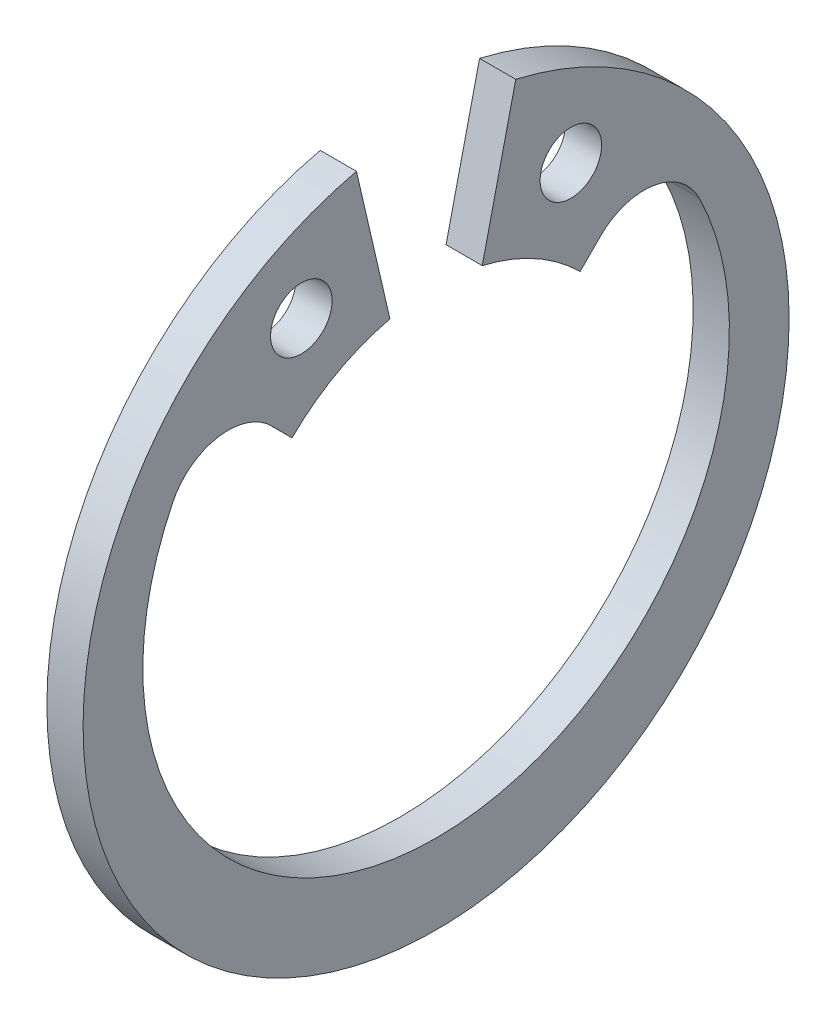
ISO-10303-21;
HEADER;
FILE_DESCRIPTION(('STEP AP214'),'2;1');
FILE_NAME('part.step','',(''),(''),'','','');
FILE_SCHEMA(('AUTOMOTIVE_DESIGN { 1 0 10303 214 1 1 1 1 }'));
ENDSEC;
DATA;
#1=APPLICATION_CONTEXT('core data for automotive mechanical design processes');
#2=APPLICATION_PROTOCOL_DEFINITION('international standard','automotive_design',2000,#1);
#3=PRODUCT_CONTEXT('',#1,'mechanical');
#4=PRODUCT('Part','Part','',(#3));
#5=PRODUCT_RELATED_PRODUCT_CATEGORY('part','',(#4));
#6=PRODUCT_DEFINITION_FORMATION('','',#4);
#7=PRODUCT_DEFINITION_CONTEXT('part definition',#1,'design');
#8=PRODUCT_DEFINITION('design','',#6,#7);
#9=PRODUCT_DEFINITION_SHAPE('','',#8);
#10=(LENGTH_UNIT() NAMED_UNIT(*) SI_UNIT(.MILLI.,.METRE.));
#11=(NAMED_UNIT(*) PLANE_ANGLE_UNIT() SI_UNIT($,.RADIAN.));
#12=(NAMED_UNIT(*) SI_UNIT($,.STERADIAN.) SOLID_ANGLE_UNIT());
#13=UNCERTAINTY_MEASURE_WITH_UNIT(LENGTH_MEASURE(1.E-05),#10,'distance_accuracy_value','');
#14=(GEOMETRIC_REPRESENTATION_CONTEXT(3) GLOBAL_UNCERTAINTY_ASSIGNED_CONTEXT((#13)) GLOBAL_UNIT_ASSIGNED_CONTEXT((#10,
#11,#12)) REPRESENTATION_CONTEXT('',''));
#15=CARTESIAN_POINT('',(0.,0.,0.));
#16=DIRECTION('',(0.,0.,1.));
#17=DIRECTION('',(1.,0.,0.));
#18=AXIS2_PLACEMENT_3D('',#15,#16,#17);
#19=CARTESIAN_POINT('',(0.,0.,0.));
#20=DIRECTION('',(1.,0.,0.));
#21=DIRECTION('',(0.,0.,-1.));
#22=AXIS2_PLACEMENT_3D('',#19,#20,#21);
#23=PLANE('',#22);
#24=DIRECTION('',(0.,0.974210515005697,0.225641025641026));
#25=VECTOR('',#24,1.);
#26=CARTESIAN_POINT('',(0.,5.50428940978219,1.2748717948718));
#27=LINE('',#26,#25);
#28=CARTESIAN_POINT('',(0.,5.50428940978219,1.2748717948718));
#29=VERTEX_POINT('',#28);
#30=CARTESIAN_POINT('',(0.,9.49855252130555,2.2));
#31=VERTEX_POINT('',#30);
#32=EDGE_CURVE('E173',#29,#31,#27,.T.);
#33=ORIENTED_EDGE('',*,*,#32,.F.);
#34=CARTESIAN_POINT('',(0.,0.,0.));
#35=DIRECTION('',(1.,0.,0.));
#36=DIRECTION('',(0.,0.,-1.));
#37=AXIS2_PLACEMENT_3D('',#34,#35,#36);
#38=CIRCLE('',#37,5.65);
#39=CARTESIAN_POINT('',(0.,4.01142977881523,3.9788102655988));
#40=VERTEX_POINT('',#39);
#41=EDGE_CURVE('E160',#29,#40,#38,.T.);
#42=ORIENTED_EDGE('',*,*,#41,.T.);
#43=DIRECTION('',(0.,-0.709987571471722,-0.704214206300673));
#44=VECTOR('',#43,1.);
#45=CARTESIAN_POINT('',(0.,4.57270556164191,4.53552195436787));
#46=LINE('',#45,#44);
#47=CARTESIAN_POINT('',(0.,4.57270556164191,4.53552195436787));
#48=VERTEX_POINT('',#47);
#49=EDGE_CURVE('E25',#48,#40,#46,.T.);
#50=ORIENTED_EDGE('',*,*,#49,.F.);
#51=CARTESIAN_POINT('',(0.,3.37554141093076,5.7425008258698));
#52=DIRECTION('',(1.,0.,0.));
#53=DIRECTION('',(0.,0.,-1.));
#54=AXIS2_PLACEMENT_3D('',#51,#52,#53);
#55=CIRCLE('',#54,1.7);
#56=CARTESIAN_POINT('',(0.,4.12607584820925,7.26785260774147));
#57=VERTEX_POINT('',#56);
#58=EDGE_CURVE('E102',#48,#57,#55,.T.);
#59=ORIENTED_EDGE('',*,*,#58,.T.);
#60=CARTESIAN_POINT('',(0.,0.55,0.));
#61=DIRECTION('',(1.,0.,0.));
#62=DIRECTION('',(0.,0.,-1.));
#63=AXIS2_PLACEMENT_3D('',#60,#61,#62);
#64=CIRCLE('',#63,8.1);
#65=CARTESIAN_POINT('',(0.,4.12607582930079,-7.26785261704519));
#66=VERTEX_POINT('',#65);
#67=EDGE_CURVE('E127',#57,#66,#64,.T.);
#68=ORIENTED_EDGE('',*,*,#67,.T.);
#69=CARTESIAN_POINT('',(0.,3.37554141093076,-5.7425008258698));
#70=DIRECTION('',(1.,0.,0.));
#71=DIRECTION('',(0.,0.,-1.));
#72=AXIS2_PLACEMENT_3D('',#69,#70,#71);
#73=CIRCLE('',#72,1.7);
#74=CARTESIAN_POINT('',(0.,4.57270556164191,-4.53552195436787));
#75=VERTEX_POINT('',#74);
#76=EDGE_CURVE('E132',#66,#75,#73,.T.);
#77=ORIENTED_EDGE('',*,*,#76,.T.);
#78=DIRECTION('',(0.,0.709987571471722,-0.704214206300673));
#79=VECTOR('',#78,1.);
#80=CARTESIAN_POINT('',(0.,4.01142977881524,-3.97881026559879));
#81=LINE('',#80,#79);
#82=CARTESIAN_POINT('',(0.,4.01142977881524,-3.97881026559879));
#83=VERTEX_POINT('',#82);
#84=EDGE_CURVE('E142',#83,#75,#81,.T.);
#85=ORIENTED_EDGE('',*,*,#84,.F.);
#86=CARTESIAN_POINT('',(0.,0.,0.));
#87=DIRECTION('',(1.,0.,0.));
#88=DIRECTION('',(0.,0.,-1.));
#89=AXIS2_PLACEMENT_3D('',#86,#87,#88);
#90=CIRCLE('',#89,5.65);
#91=CARTESIAN_POINT('',(0.,5.50428940978219,-1.27487179487179));
#92=VERTEX_POINT('',#91);
#93=EDGE_CURVE('E143',#83,#92,#90,.T.);
#94=ORIENTED_EDGE('',*,*,#93,.T.);
#95=DIRECTION('',(0.,-0.974210515005697,0.225641025641026));
#96=VECTOR('',#95,1.);
#97=CARTESIAN_POINT('',(0.,9.49855252130555,-2.2));
#98=LINE('',#97,#96);
#99=CARTESIAN_POINT('',(0.,9.49855252130555,-2.2));
#100=VERTEX_POINT('',#99);
#101=EDGE_CURVE('E180',#100,#92,#98,.T.);
#102=ORIENTED_EDGE('',*,*,#101,.F.);
#103=CARTESIAN_POINT('',(0.,0.,0.));
#104=DIRECTION('',(1.,0.,0.));
#105=DIRECTION('',(0.,0.,-1.));
#106=AXIS2_PLACEMENT_3D('',#103,#104,#105);
#107=CIRCLE('',#106,9.75);
#108=EDGE_CURVE('E161',#31,#100,#107,.T.);
#109=ORIENTED_EDGE('',*,*,#108,.F.);
#110=EDGE_LOOP('',(#33,#42,#50,#59,#68,#77,#85,#94,#102,#109));
#111=FACE_BOUND('',#110,.T.);
#112=CARTESIAN_POINT('',(0.,6.74086019419995,-3.7216668096769));
#113=DIRECTION('',(1.,0.,0.));
#114=DIRECTION('',(0.,0.,-1.));
#115=AXIS2_PLACEMENT_3D('',#112,#113,#114);
#116=CIRCLE('',#115,0.85);
#117=CARTESIAN_POINT('',(0.,6.74086019419995,-4.5716668096769));
#118=VERTEX_POINT('',#117);
#119=EDGE_CURVE('E9',#118,#118,#116,.T.);
#120=ORIENTED_EDGE('',*,*,#119,.T.);
#121=EDGE_LOOP('',(#120));
#122=FACE_BOUND('',#121,.T.);
#123=CARTESIAN_POINT('',(0.,6.74086019419995,3.7216668096769));
#124=DIRECTION('',(1.,0.,0.));
#125=DIRECTION('',(0.,0.,-1.));
#126=AXIS2_PLACEMENT_3D('',#123,#124,#125);
#127=CIRCLE('',#126,0.85);
#128=CARTESIAN_POINT('',(0.,6.74086019419995,2.8716668096769));
#129=VERTEX_POINT('',#128);
#130=EDGE_CURVE('E114',#129,#129,#127,.T.);
#131=ORIENTED_EDGE('',*,*,#130,.T.);
#132=EDGE_LOOP('',(#131));
#133=FACE_BOUND('',#132,.T.);
#134=ADVANCED_FACE('F15',(#111,#122,#133),#23,.F.);
#135=CARTESIAN_POINT('',(1.,6.74086019419995,-3.7216668096769));
#136=DIRECTION('',(-1.,0.,0.));
#137=DIRECTION('',(0.,0.,1.));
#138=AXIS2_PLACEMENT_3D('',#135,#136,#137);
#139=CYLINDRICAL_SURFACE('',#138,0.85);
#140=ORIENTED_EDGE('',*,*,#119,.F.);
#141=EDGE_LOOP('',(#140));
#142=FACE_BOUND('',#141,.T.);
#143=CARTESIAN_POINT('',(1.,6.74086019419995,-3.7216668096769));
#144=DIRECTION('',(1.,0.,0.));
#145=DIRECTION('',(0.,0.,-1.));
#146=AXIS2_PLACEMENT_3D('',#143,#144,#145);
#147=CIRCLE('',#146,0.85);
#148=CARTESIAN_POINT('',(1.,6.74086019419995,-4.5716668096769));
#149=VERTEX_POINT('',#148);
#150=EDGE_CURVE('E138',#149,#149,#147,.T.);
#151=ORIENTED_EDGE('',*,*,#150,.T.);
#152=EDGE_LOOP('',(#151));
#153=FACE_BOUND('',#152,.T.);
#154=ADVANCED_FACE('F213',(#142,#153),#139,.F.);
#155=CARTESIAN_POINT('',(1.,4.57270556164191,4.53552195436787));
#156=DIRECTION('',(0.,0.704214206300673,-0.709987571471722));
#157=DIRECTION('',(0.,0.709987571471722,0.704214206300673));
#158=AXIS2_PLACEMENT_3D('',#155,#156,#157);
#159=PLANE('',#158);
#160=ORIENTED_EDGE('',*,*,#49,.T.);
#161=DIRECTION('',(-1.,0.,0.));
#162=VECTOR('',#161,1.);
#163=CARTESIAN_POINT('',(1.,4.01142977881523,3.9788102655988));
#164=LINE('',#163,#162);
#165=CARTESIAN_POINT('',(1.,4.01142977881523,3.9788102655988));
#166=VERTEX_POINT('',#165);
#167=EDGE_CURVE('E110',#166,#40,#164,.T.);
#168=ORIENTED_EDGE('',*,*,#167,.F.);
#169=DIRECTION('',(0.,-0.709987571471722,-0.704214206300673));
#170=VECTOR('',#169,1.);
#171=CARTESIAN_POINT('',(1.,4.57270556164191,4.53552195436787));
#172=LINE('',#171,#170);
#173=CARTESIAN_POINT('',(1.,4.57270556164191,4.53552195436787));
#174=VERTEX_POINT('',#173);
#175=EDGE_CURVE('E107',#174,#166,#172,.T.);
#176=ORIENTED_EDGE('',*,*,#175,.F.);
#177=DIRECTION('',(-1.,0.,0.));
#178=VECTOR('',#177,1.);
#179=CARTESIAN_POINT('',(1.,4.57270556164191,4.53552195436787));
#180=LINE('',#179,#178);
#181=EDGE_CURVE('E95',#174,#48,#180,.T.);
#182=ORIENTED_EDGE('',*,*,#181,.T.);
#183=EDGE_LOOP('',(#160,#168,#176,#182));
#184=FACE_BOUND('',#183,.T.);
#185=ADVANCED_FACE('F108',(#184),#159,.F.);
#186=CARTESIAN_POINT('',(1.,3.37554141093076,5.7425008258698));
#187=DIRECTION('',(-1.,0.,0.));
#188=DIRECTION('',(0.,0.,1.));
#189=AXIS2_PLACEMENT_3D('',#186,#187,#188);
#190=CYLINDRICAL_SURFACE('',#189,1.7);
#191=ORIENTED_EDGE('',*,*,#58,.F.);
#192=ORIENTED_EDGE('',*,*,#181,.F.);
#193=CARTESIAN_POINT('',(1.,3.37554141093076,5.7425008258698));
#194=DIRECTION('',(1.,0.,0.));
#195=DIRECTION('',(0.,0.,-1.));
#196=AXIS2_PLACEMENT_3D('',#193,#194,#195);
#197=CIRCLE('',#196,1.7);
#198=CARTESIAN_POINT('',(1.,4.12607584820925,7.26785260774147));
#199=VERTEX_POINT('',#198);
#200=EDGE_CURVE('E100',#174,#199,#197,.T.);
#201=ORIENTED_EDGE('',*,*,#200,.T.);
#202=DIRECTION('',(-1.,0.,0.));
#203=VECTOR('',#202,1.);
#204=CARTESIAN_POINT('',(1.,4.12607584820925,7.26785260774147));
#205=LINE('',#204,#203);
#206=EDGE_CURVE('E155',#199,#57,#205,.T.);
#207=ORIENTED_EDGE('',*,*,#206,.T.);
#208=EDGE_LOOP('',(#191,#192,#201,#207));
#209=FACE_BOUND('',#208,.T.);
#210=ADVANCED_FACE('F97',(#209),#190,.F.);
#211=CARTESIAN_POINT('',(1.,0.55,0.));
#212=DIRECTION('',(-1.,0.,0.));
#213=DIRECTION('',(0.,0.,1.));
#214=AXIS2_PLACEMENT_3D('',#211,#212,#213);
#215=CYLINDRICAL_SURFACE('',#214,8.1);
#216=ORIENTED_EDGE('',*,*,#67,.F.);
#217=ORIENTED_EDGE('',*,*,#206,.F.);
#218=CARTESIAN_POINT('',(1.,0.55,0.));
#219=DIRECTION('',(1.,0.,0.));
#220=DIRECTION('',(0.,0.,-1.));
#221=AXIS2_PLACEMENT_3D('',#218,#219,#220);
#222=CIRCLE('',#221,8.1);
#223=CARTESIAN_POINT('',(1.,4.12607582930079,-7.26785261704519));
#224=VERTEX_POINT('',#223);
#225=EDGE_CURVE('E121',#199,#224,#222,.T.);
#226=ORIENTED_EDGE('',*,*,#225,.T.);
#227=DIRECTION('',(-1.,0.,0.));
#228=VECTOR('',#227,1.);
#229=CARTESIAN_POINT('',(1.,4.12607582930079,-7.26785261704519));
#230=LINE('',#229,#228);
#231=EDGE_CURVE('E129',#224,#66,#230,.T.);
#232=ORIENTED_EDGE('',*,*,#231,.T.);
#233=EDGE_LOOP('',(#216,#217,#226,#232));
#234=FACE_BOUND('',#233,.T.);
#235=ADVANCED_FACE('F242',(#234),#215,.F.);
#236=CARTESIAN_POINT('',(1.,3.37554141093076,-5.7425008258698));
#237=DIRECTION('',(-1.,0.,0.));
#238=DIRECTION('',(0.,0.,1.));
#239=AXIS2_PLACEMENT_3D('',#236,#237,#238);
#240=CYLINDRICAL_SURFACE('',#239,1.7);
#241=ORIENTED_EDGE('',*,*,#76,.F.);
#242=ORIENTED_EDGE('',*,*,#231,.F.);
#243=CARTESIAN_POINT('',(1.,3.37554141093076,-5.7425008258698));
#244=DIRECTION('',(1.,0.,0.));
#245=DIRECTION('',(0.,0.,-1.));
#246=AXIS2_PLACEMENT_3D('',#243,#244,#245);
#247=CIRCLE('',#246,1.7);
#248=CARTESIAN_POINT('',(1.,4.57270556164191,-4.53552195436787));
#249=VERTEX_POINT('',#248);
#250=EDGE_CURVE('E123',#224,#249,#247,.T.);
#251=ORIENTED_EDGE('',*,*,#250,.T.);
#252=DIRECTION('',(-1.,0.,0.));
#253=VECTOR('',#252,1.);
#254=CARTESIAN_POINT('',(1.,4.57270556164191,-4.53552195436787));
#255=LINE('',#254,#253);
#256=EDGE_CURVE('E133',#249,#75,#255,.T.);
#257=ORIENTED_EDGE('',*,*,#256,.T.);
#258=EDGE_LOOP('',(#241,#242,#251,#257));
#259=FACE_BOUND('',#258,.T.);
#260=ADVANCED_FACE('F223',(#259),#240,.F.);
#261=CARTESIAN_POINT('',(1.,4.01142977881524,-3.97881026559879));
#262=DIRECTION('',(0.,0.704214206300673,0.709987571471722));
#263=DIRECTION('',(0.,-0.709987571471722,0.704214206300673));
#264=AXIS2_PLACEMENT_3D('',#261,#262,#263);
#265=PLANE('',#264);
#266=ORIENTED_EDGE('',*,*,#84,.T.);
#267=ORIENTED_EDGE('',*,*,#256,.F.);
#268=DIRECTION('',(0.,0.709987571471722,-0.704214206300673));
#269=VECTOR('',#268,1.);
#270=CARTESIAN_POINT('',(1.,4.01142977881524,-3.97881026559879));
#271=LINE('',#270,#269);
#272=CARTESIAN_POINT('',(1.,4.01142977881524,-3.97881026559879));
#273=VERTEX_POINT('',#272);
#274=EDGE_CURVE('E168',#273,#249,#271,.T.);
#275=ORIENTED_EDGE('',*,*,#274,.F.);
#276=DIRECTION('',(-1.,0.,0.));
#277=VECTOR('',#276,1.);
#278=CARTESIAN_POINT('',(1.,4.01142977881524,-3.97881026559879));
#279=LINE('',#278,#277);
#280=EDGE_CURVE('E139',#273,#83,#279,.T.);
#281=ORIENTED_EDGE('',*,*,#280,.T.);
#282=EDGE_LOOP('',(#266,#267,#275,#281));
#283=FACE_BOUND('',#282,.T.);
#284=ADVANCED_FACE('F220',(#283),#265,.F.);
#285=CARTESIAN_POINT('',(1.,0.,0.));
#286=DIRECTION('',(-1.,0.,0.));
#287=DIRECTION('',(0.,0.,1.));
#288=AXIS2_PLACEMENT_3D('',#285,#286,#287);
#289=CYLINDRICAL_SURFACE('',#288,5.65);
#290=ORIENTED_EDGE('',*,*,#93,.F.);
#291=ORIENTED_EDGE('',*,*,#280,.F.);
#292=CARTESIAN_POINT('',(1.,0.,0.));
#293=DIRECTION('',(1.,0.,0.));
#294=DIRECTION('',(0.,0.,-1.));
#295=AXIS2_PLACEMENT_3D('',#292,#293,#294);
#296=CIRCLE('',#295,5.65);
#297=CARTESIAN_POINT('',(1.,5.50428940978219,-1.27487179487179));
#298=VERTEX_POINT('',#297);
#299=EDGE_CURVE('E170',#273,#298,#296,.T.);
#300=ORIENTED_EDGE('',*,*,#299,.T.);
#301=DIRECTION('',(-1.,0.,0.));
#302=VECTOR('',#301,1.);
#303=CARTESIAN_POINT('',(1.,5.50428940978219,-1.27487179487179));
#304=LINE('',#303,#302);
#305=EDGE_CURVE('E19',#298,#92,#304,.T.);
#306=ORIENTED_EDGE('',*,*,#305,.T.);
#307=EDGE_LOOP('',(#290,#291,#300,#306));
#308=FACE_BOUND('',#307,.T.);
#309=ADVANCED_FACE('F222',(#308),#289,.F.);
#310=CARTESIAN_POINT('',(1.,9.49855252130555,-2.2));
#311=DIRECTION('',(0.,-0.225641025641026,-0.974210515005697));
#312=DIRECTION('',(0.,0.974210515005697,-0.225641025641026));
#313=AXIS2_PLACEMENT_3D('',#310,#311,#312);
#314=PLANE('',#313);
#315=ORIENTED_EDGE('',*,*,#101,.T.);
#316=ORIENTED_EDGE('',*,*,#305,.F.);
#317=DIRECTION('',(0.,-0.974210515005697,0.225641025641026));
#318=VECTOR('',#317,1.);
#319=CARTESIAN_POINT('',(1.,9.49855252130555,-2.2));
#320=LINE('',#319,#318);
#321=CARTESIAN_POINT('',(1.,9.49855252130555,-2.2));
#322=VERTEX_POINT('',#321);
#323=EDGE_CURVE('E149',#322,#298,#320,.T.);
#324=ORIENTED_EDGE('',*,*,#323,.F.);
#325=DIRECTION('',(-1.,0.,0.));
#326=VECTOR('',#325,1.);
#327=CARTESIAN_POINT('',(1.,9.49855252130555,-2.2));
#328=LINE('',#327,#326);
#329=EDGE_CURVE('E164',#322,#100,#328,.T.);
#330=ORIENTED_EDGE('',*,*,#329,.T.);
#331=EDGE_LOOP('',(#315,#316,#324,#330));
#332=FACE_BOUND('',#331,.T.);
#333=ADVANCED_FACE('F225',(#332),#314,.F.);
#334=CARTESIAN_POINT('',(1.,0.,0.));
#335=DIRECTION('',(-1.,0.,0.));
#336=DIRECTION('',(0.,0.,1.));
#337=AXIS2_PLACEMENT_3D('',#334,#335,#336);
#338=CYLINDRICAL_SURFACE('',#337,9.75);
#339=ORIENTED_EDGE('',*,*,#108,.T.);
#340=ORIENTED_EDGE('',*,*,#329,.F.);
#341=CARTESIAN_POINT('',(1.,0.,0.));
#342=DIRECTION('',(1.,0.,0.));
#343=DIRECTION('',(0.,0.,-1.));
#344=AXIS2_PLACEMENT_3D('',#341,#342,#343);
#345=CIRCLE('',#344,9.75);
#346=CARTESIAN_POINT('',(1.,9.49855252130555,2.2));
#347=VERTEX_POINT('',#346);
#348=EDGE_CURVE('E137',#347,#322,#345,.T.);
#349=ORIENTED_EDGE('',*,*,#348,.F.);
#350=DIRECTION('',(-1.,0.,0.));
#351=VECTOR('',#350,1.);
#352=CARTESIAN_POINT('',(1.,9.49855252130555,2.2));
#353=LINE('',#352,#351);
#354=EDGE_CURVE('E165',#347,#31,#353,.T.);
#355=ORIENTED_EDGE('',*,*,#354,.T.);
#356=EDGE_LOOP('',(#339,#340,#349,#355));
#357=FACE_BOUND('',#356,.T.);
#358=ADVANCED_FACE('F227',(#357),#338,.T.);
#359=CARTESIAN_POINT('',(1.,5.50428940978219,1.2748717948718));
#360=DIRECTION('',(0.,-0.225641025641026,0.974210515005697));
#361=DIRECTION('',(0.,-0.974210515005697,-0.225641025641026));
#362=AXIS2_PLACEMENT_3D('',#359,#360,#361);
#363=PLANE('',#362);
#364=ORIENTED_EDGE('',*,*,#32,.T.);
#365=ORIENTED_EDGE('',*,*,#354,.F.);
#366=DIRECTION('',(0.,0.974210515005697,0.225641025641026));
#367=VECTOR('',#366,1.);
#368=CARTESIAN_POINT('',(1.,5.50428940978219,1.2748717948718));
#369=LINE('',#368,#367);
#370=CARTESIAN_POINT('',(1.,5.50428940978219,1.2748717948718));
#371=VERTEX_POINT('',#370);
#372=EDGE_CURVE('E135',#371,#347,#369,.T.);
#373=ORIENTED_EDGE('',*,*,#372,.F.);
#374=DIRECTION('',(-1.,0.,0.));
#375=VECTOR('',#374,1.);
#376=CARTESIAN_POINT('',(1.,5.50428940978219,1.2748717948718));
#377=LINE('',#376,#375);
#378=EDGE_CURVE('E157',#371,#29,#377,.T.);
#379=ORIENTED_EDGE('',*,*,#378,.T.);
#380=EDGE_LOOP('',(#364,#365,#373,#379));
#381=FACE_BOUND('',#380,.T.);
#382=ADVANCED_FACE('F198',(#381),#363,.F.);
#383=CARTESIAN_POINT('',(1.,6.74086019419995,3.7216668096769));
#384=DIRECTION('',(-1.,0.,0.));
#385=DIRECTION('',(0.,0.,1.));
#386=AXIS2_PLACEMENT_3D('',#383,#384,#385);
#387=CYLINDRICAL_SURFACE('',#386,0.85);
#388=ORIENTED_EDGE('',*,*,#130,.F.);
#389=EDGE_LOOP('',(#388));
#390=FACE_BOUND('',#389,.T.);
#391=CARTESIAN_POINT('',(1.,6.74086019419995,3.7216668096769));
#392=DIRECTION('',(1.,0.,0.));
#393=DIRECTION('',(0.,0.,-1.));
#394=AXIS2_PLACEMENT_3D('',#391,#392,#393);
#395=CIRCLE('',#394,0.85);
#396=CARTESIAN_POINT('',(1.,6.74086019419995,2.8716668096769));
#397=VERTEX_POINT('',#396);
#398=EDGE_CURVE('E144',#397,#397,#395,.T.);
#399=ORIENTED_EDGE('',*,*,#398,.T.);
#400=EDGE_LOOP('',(#399));
#401=FACE_BOUND('',#400,.T.);
#402=ADVANCED_FACE('F17',(#390,#401),#387,.F.);
#403=CARTESIAN_POINT('',(1.,0.,0.));
#404=DIRECTION('',(1.,0.,0.));
#405=DIRECTION('',(0.,0.,-1.));
#406=AXIS2_PLACEMENT_3D('',#403,#404,#405);
#407=PLANE('',#406);
#408=ORIENTED_EDGE('',*,*,#372,.T.);
#409=ORIENTED_EDGE('',*,*,#348,.T.);
#410=ORIENTED_EDGE('',*,*,#323,.T.);
#411=ORIENTED_EDGE('',*,*,#299,.F.);
#412=ORIENTED_EDGE('',*,*,#274,.T.);
#413=ORIENTED_EDGE('',*,*,#250,.F.);
#414=ORIENTED_EDGE('',*,*,#225,.F.);
#415=ORIENTED_EDGE('',*,*,#200,.F.);
#416=ORIENTED_EDGE('',*,*,#175,.T.);
#417=CARTESIAN_POINT('',(1.,0.,0.));
#418=DIRECTION('',(1.,0.,0.));
#419=DIRECTION('',(0.,0.,-1.));
#420=AXIS2_PLACEMENT_3D('',#417,#418,#419);
#421=CIRCLE('',#420,5.65);
#422=EDGE_CURVE('E145',#371,#166,#421,.T.);
#423=ORIENTED_EDGE('',*,*,#422,.F.);
#424=EDGE_LOOP('',(#408,#409,#410,#411,#412,#413,#414,#415,#416,#423));
#425=FACE_BOUND('',#424,.T.);
#426=ORIENTED_EDGE('',*,*,#150,.F.);
#427=EDGE_LOOP('',(#426));
#428=FACE_BOUND('',#427,.T.);
#429=ORIENTED_EDGE('',*,*,#398,.F.);
#430=EDGE_LOOP('',(#429));
#431=FACE_BOUND('',#430,.T.);
#432=ADVANCED_FACE('F117',(#425,#428,#431),#407,.T.);
#433=CARTESIAN_POINT('',(1.,0.,0.));
#434=DIRECTION('',(-1.,0.,0.));
#435=DIRECTION('',(0.,0.,1.));
#436=AXIS2_PLACEMENT_3D('',#433,#434,#435);
#437=CYLINDRICAL_SURFACE('',#436,5.65);
#438=ORIENTED_EDGE('',*,*,#41,.F.);
#439=ORIENTED_EDGE('',*,*,#378,.F.);
#440=ORIENTED_EDGE('',*,*,#422,.T.);
#441=ORIENTED_EDGE('',*,*,#167,.T.);
#442=EDGE_LOOP('',(#438,#439,#440,#441));
#443=FACE_BOUND('',#442,.T.);
#444=ADVANCED_FACE('F202',(#443),#437,.F.);
#445=CLOSED_SHELL('',(#134,#154,#185,#210,#235,#260,#284,#309,#333,#358,#382,#402,#432,#444));
#446=MANIFOLD_SOLID_BREP('B1',#445);
#447=ADVANCED_BREP_SHAPE_REPRESENTATION('',(#18,#446),#14);
#448=SHAPE_DEFINITION_REPRESENTATION(#9,#447);
ENDSEC;
END-ISO-10303-21;
